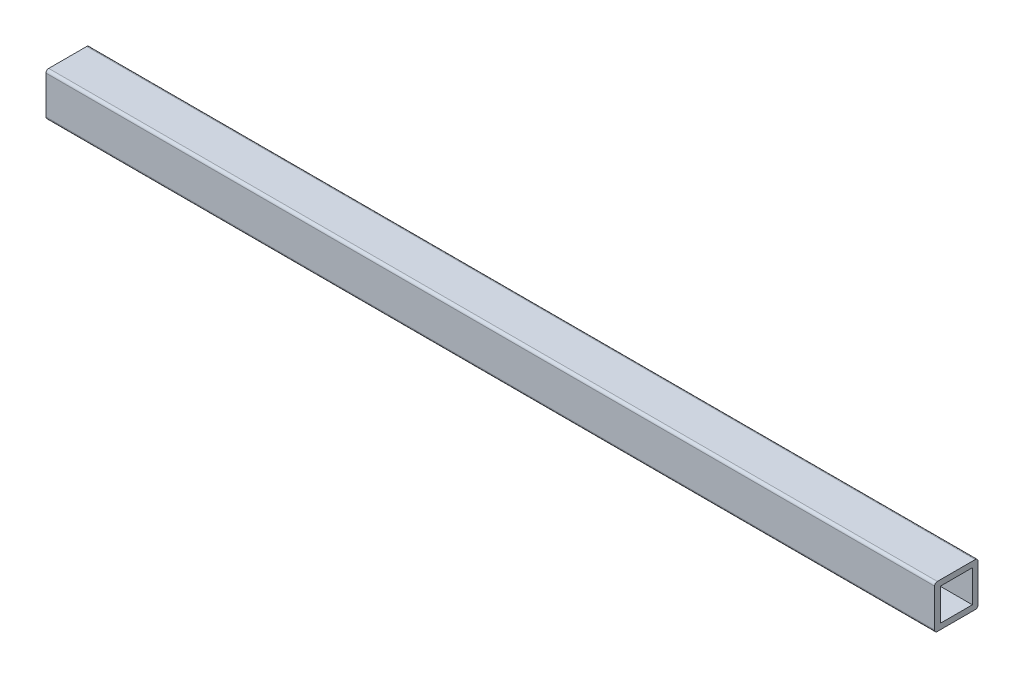
ISO-10303-21;
HEADER;
FILE_DESCRIPTION(('STEP AP214'),'2;1');
FILE_NAME('part.step','',(''),(''),'','','');
FILE_SCHEMA(('AUTOMOTIVE_DESIGN { 1 0 10303 214 1 1 1 1 }'));
ENDSEC;
DATA;
#1=APPLICATION_CONTEXT('core data for automotive mechanical design processes');
#2=APPLICATION_PROTOCOL_DEFINITION('international standard','automotive_design',2000,#1);
#3=PRODUCT_CONTEXT('',#1,'mechanical');
#4=PRODUCT('Part','Part','',(#3));
#5=PRODUCT_RELATED_PRODUCT_CATEGORY('part','',(#4));
#6=PRODUCT_DEFINITION_FORMATION('','',#4);
#7=PRODUCT_DEFINITION_CONTEXT('part definition',#1,'design');
#8=PRODUCT_DEFINITION('design','',#6,#7);
#9=PRODUCT_DEFINITION_SHAPE('','',#8);
#10=(LENGTH_UNIT() NAMED_UNIT(*) SI_UNIT(.MILLI.,.METRE.));
#11=(NAMED_UNIT(*) PLANE_ANGLE_UNIT() SI_UNIT($,.RADIAN.));
#12=(NAMED_UNIT(*) SI_UNIT($,.STERADIAN.) SOLID_ANGLE_UNIT());
#13=UNCERTAINTY_MEASURE_WITH_UNIT(LENGTH_MEASURE(1.E-05),#10,'distance_accuracy_value','');
#14=(GEOMETRIC_REPRESENTATION_CONTEXT(3) GLOBAL_UNCERTAINTY_ASSIGNED_CONTEXT((#13)) GLOBAL_UNIT_ASSIGNED_CONTEXT((#10,
#11,#12)) REPRESENTATION_CONTEXT('',''));
#15=CARTESIAN_POINT('',(0.,0.,0.));
#16=DIRECTION('',(0.,0.,1.));
#17=DIRECTION('',(1.,0.,0.));
#18=AXIS2_PLACEMENT_3D('',#15,#16,#17);
#19=CARTESIAN_POINT('',(260.096,-5.55625,-5.55625));
#20=DIRECTION('',(-1.,0.,0.));
#21=DIRECTION('',(0.,0.,1.));
#22=AXIS2_PLACEMENT_3D('',#19,#20,#21);
#23=CYLINDRICAL_SURFACE('',#22,0.79375);
#24=CARTESIAN_POINT('',(0.,-5.55625,-5.55625));
#25=DIRECTION('',(1.,0.,0.));
#26=DIRECTION('',(0.,0.,-1.));
#27=AXIS2_PLACEMENT_3D('',#24,#25,#26);
#28=CIRCLE('',#27,0.79375);
#29=CARTESIAN_POINT('',(0.,-6.35,-5.55624999999999));
#30=VERTEX_POINT('',#29);
#31=CARTESIAN_POINT('',(0.,-5.55624999999999,-6.35));
#32=VERTEX_POINT('',#31);
#33=EDGE_CURVE('E196',#30,#32,#28,.T.);
#34=ORIENTED_EDGE('',*,*,#33,.T.);
#35=DIRECTION('',(-1.,0.,0.));
#36=VECTOR('',#35,1.);
#37=CARTESIAN_POINT('',(260.096,-5.55624999999999,-6.35));
#38=LINE('',#37,#36);
#39=CARTESIAN_POINT('',(260.096,-5.55624999999999,-6.35));
#40=VERTEX_POINT('',#39);
#41=EDGE_CURVE('E12',#40,#32,#38,.T.);
#42=ORIENTED_EDGE('',*,*,#41,.F.);
#43=CARTESIAN_POINT('',(260.096,-5.55625,-5.55625));
#44=DIRECTION('',(1.,0.,0.));
#45=DIRECTION('',(0.,0.,-1.));
#46=AXIS2_PLACEMENT_3D('',#43,#44,#45);
#47=CIRCLE('',#46,0.79375);
#48=CARTESIAN_POINT('',(260.096,-6.35,-5.55624999999999));
#49=VERTEX_POINT('',#48);
#50=EDGE_CURVE('E249',#49,#40,#47,.T.);
#51=ORIENTED_EDGE('',*,*,#50,.F.);
#52=DIRECTION('',(-1.,0.,0.));
#53=VECTOR('',#52,1.);
#54=CARTESIAN_POINT('',(260.096,-6.35,-5.55624999999999));
#55=LINE('',#54,#53);
#56=EDGE_CURVE('E211',#49,#30,#55,.T.);
#57=ORIENTED_EDGE('',*,*,#56,.T.);
#58=EDGE_LOOP('',(#34,#42,#51,#57));
#59=FACE_BOUND('',#58,.T.);
#60=ADVANCED_FACE('F60',(#59),#23,.T.);
#61=CARTESIAN_POINT('',(260.096,-5.55624999999999,-6.35));
#62=DIRECTION('',(0.,0.,1.));
#63=DIRECTION('',(1.,0.,0.));
#64=AXIS2_PLACEMENT_3D('',#61,#62,#63);
#65=PLANE('',#64);
#66=DIRECTION('',(0.,1.,0.));
#67=VECTOR('',#66,1.);
#68=CARTESIAN_POINT('',(0.,-5.55624999999999,-6.35));
#69=LINE('',#68,#67);
#70=CARTESIAN_POINT('',(0.,5.55625,-6.35));
#71=VERTEX_POINT('',#70);
#72=EDGE_CURVE('E199',#32,#71,#69,.T.);
#73=ORIENTED_EDGE('',*,*,#72,.T.);
#74=DIRECTION('',(-1.,0.,0.));
#75=VECTOR('',#74,1.);
#76=CARTESIAN_POINT('',(260.096,5.55625,-6.35));
#77=LINE('',#76,#75);
#78=CARTESIAN_POINT('',(260.096,5.55625,-6.35));
#79=VERTEX_POINT('',#78);
#80=EDGE_CURVE('E70',#79,#71,#77,.T.);
#81=ORIENTED_EDGE('',*,*,#80,.F.);
#82=DIRECTION('',(0.,1.,0.));
#83=VECTOR('',#82,1.);
#84=CARTESIAN_POINT('',(260.096,-5.55624999999999,-6.35));
#85=LINE('',#84,#83);
#86=EDGE_CURVE('E251',#40,#79,#85,.T.);
#87=ORIENTED_EDGE('',*,*,#86,.F.);
#88=ORIENTED_EDGE('',*,*,#41,.T.);
#89=EDGE_LOOP('',(#73,#81,#87,#88));
#90=FACE_BOUND('',#89,.T.);
#91=ADVANCED_FACE('F286',(#90),#65,.F.);
#92=CARTESIAN_POINT('',(260.096,5.55625,-5.55625));
#93=DIRECTION('',(-1.,0.,0.));
#94=DIRECTION('',(0.,0.,1.));
#95=AXIS2_PLACEMENT_3D('',#92,#93,#94);
#96=CYLINDRICAL_SURFACE('',#95,0.79375);
#97=CARTESIAN_POINT('',(0.,5.55625,-5.55625));
#98=DIRECTION('',(1.,0.,0.));
#99=DIRECTION('',(0.,0.,-1.));
#100=AXIS2_PLACEMENT_3D('',#97,#98,#99);
#101=CIRCLE('',#100,0.79375);
#102=CARTESIAN_POINT('',(0.,6.35,-5.55624999999999));
#103=VERTEX_POINT('',#102);
#104=EDGE_CURVE('E201',#71,#103,#101,.T.);
#105=ORIENTED_EDGE('',*,*,#104,.T.);
#106=DIRECTION('',(-1.,0.,0.));
#107=VECTOR('',#106,1.);
#108=CARTESIAN_POINT('',(260.096,6.35,-5.55624999999999));
#109=LINE('',#108,#107);
#110=CARTESIAN_POINT('',(260.096,6.35,-5.55624999999999));
#111=VERTEX_POINT('',#110);
#112=EDGE_CURVE('E218',#111,#103,#109,.T.);
#113=ORIENTED_EDGE('',*,*,#112,.F.);
#114=CARTESIAN_POINT('',(260.096,5.55625,-5.55625));
#115=DIRECTION('',(1.,0.,0.));
#116=DIRECTION('',(0.,0.,-1.));
#117=AXIS2_PLACEMENT_3D('',#114,#115,#116);
#118=CIRCLE('',#117,0.79375);
#119=EDGE_CURVE('E256',#79,#111,#118,.T.);
#120=ORIENTED_EDGE('',*,*,#119,.F.);
#121=ORIENTED_EDGE('',*,*,#80,.T.);
#122=EDGE_LOOP('',(#105,#113,#120,#121));
#123=FACE_BOUND('',#122,.T.);
#124=ADVANCED_FACE('F291',(#123),#96,.T.);
#125=CARTESIAN_POINT('',(260.096,6.35,5.55625));
#126=DIRECTION('',(0.,-1.,0.));
#127=DIRECTION('',(0.,0.,-1.));
#128=AXIS2_PLACEMENT_3D('',#125,#126,#127);
#129=PLANE('',#128);
#130=DIRECTION('',(0.,0.,1.));
#131=VECTOR('',#130,1.);
#132=CARTESIAN_POINT('',(0.,6.35,5.55625));
#133=LINE('',#132,#131);
#134=CARTESIAN_POINT('',(0.,6.35,5.55625));
#135=VERTEX_POINT('',#134);
#136=EDGE_CURVE('E203',#103,#135,#133,.T.);
#137=ORIENTED_EDGE('',*,*,#136,.T.);
#138=DIRECTION('',(-1.,0.,0.));
#139=VECTOR('',#138,1.);
#140=CARTESIAN_POINT('',(260.096,6.35,5.55625));
#141=LINE('',#140,#139);
#142=CARTESIAN_POINT('',(260.096,6.35,5.55625));
#143=VERTEX_POINT('',#142);
#144=EDGE_CURVE('E215',#143,#135,#141,.T.);
#145=ORIENTED_EDGE('',*,*,#144,.F.);
#146=DIRECTION('',(0.,0.,1.));
#147=VECTOR('',#146,1.);
#148=CARTESIAN_POINT('',(260.096,6.35,5.55625));
#149=LINE('',#148,#147);
#150=EDGE_CURVE('E258',#111,#143,#149,.T.);
#151=ORIENTED_EDGE('',*,*,#150,.F.);
#152=ORIENTED_EDGE('',*,*,#112,.T.);
#153=EDGE_LOOP('',(#137,#145,#151,#152));
#154=FACE_BOUND('',#153,.T.);
#155=ADVANCED_FACE('F264',(#154),#129,.F.);
#156=CARTESIAN_POINT('',(260.096,5.55625,5.55625));
#157=DIRECTION('',(-1.,0.,0.));
#158=DIRECTION('',(0.,0.,1.));
#159=AXIS2_PLACEMENT_3D('',#156,#157,#158);
#160=CYLINDRICAL_SURFACE('',#159,0.79375);
#161=CARTESIAN_POINT('',(0.,5.55625,5.55625));
#162=DIRECTION('',(1.,0.,0.));
#163=DIRECTION('',(0.,0.,1.));
#164=AXIS2_PLACEMENT_3D('',#161,#162,#163);
#165=CIRCLE('',#164,0.79375);
#166=CARTESIAN_POINT('',(0.,5.55624999999999,6.35));
#167=VERTEX_POINT('',#166);
#168=EDGE_CURVE('E205',#135,#167,#165,.T.);
#169=ORIENTED_EDGE('',*,*,#168,.T.);
#170=DIRECTION('',(-1.,0.,0.));
#171=VECTOR('',#170,1.);
#172=CARTESIAN_POINT('',(260.096,5.55624999999999,6.35));
#173=LINE('',#172,#171);
#174=CARTESIAN_POINT('',(260.096,5.55624999999999,6.35));
#175=VERTEX_POINT('',#174);
#176=EDGE_CURVE('E175',#175,#167,#173,.T.);
#177=ORIENTED_EDGE('',*,*,#176,.F.);
#178=CARTESIAN_POINT('',(260.096,5.55625,5.55625));
#179=DIRECTION('',(1.,0.,0.));
#180=DIRECTION('',(0.,0.,1.));
#181=AXIS2_PLACEMENT_3D('',#178,#179,#180);
#182=CIRCLE('',#181,0.79375);
#183=EDGE_CURVE('E166',#143,#175,#182,.T.);
#184=ORIENTED_EDGE('',*,*,#183,.F.);
#185=ORIENTED_EDGE('',*,*,#144,.T.);
#186=EDGE_LOOP('',(#169,#177,#184,#185));
#187=FACE_BOUND('',#186,.T.);
#188=ADVANCED_FACE('F268',(#187),#160,.T.);
#189=CARTESIAN_POINT('',(260.096,-5.55624999999999,6.35));
#190=DIRECTION('',(0.,0.,-1.));
#191=DIRECTION('',(-1.,0.,0.));
#192=AXIS2_PLACEMENT_3D('',#189,#190,#191);
#193=PLANE('',#192);
#194=DIRECTION('',(0.,-1.,0.));
#195=VECTOR('',#194,1.);
#196=CARTESIAN_POINT('',(0.,-5.55624999999999,6.35));
#197=LINE('',#196,#195);
#198=CARTESIAN_POINT('',(0.,-5.55624999999999,6.35));
#199=VERTEX_POINT('',#198);
#200=EDGE_CURVE('E174',#167,#199,#197,.T.);
#201=ORIENTED_EDGE('',*,*,#200,.T.);
#202=DIRECTION('',(-1.,0.,0.));
#203=VECTOR('',#202,1.);
#204=CARTESIAN_POINT('',(260.096,-5.55624999999999,6.35));
#205=LINE('',#204,#203);
#206=CARTESIAN_POINT('',(260.096,-5.55624999999999,6.35));
#207=VERTEX_POINT('',#206);
#208=EDGE_CURVE('E171',#207,#199,#205,.T.);
#209=ORIENTED_EDGE('',*,*,#208,.F.);
#210=DIRECTION('',(0.,-1.,0.));
#211=VECTOR('',#210,1.);
#212=CARTESIAN_POINT('',(260.096,-5.55624999999999,6.35));
#213=LINE('',#212,#211);
#214=EDGE_CURVE('E160',#175,#207,#213,.T.);
#215=ORIENTED_EDGE('',*,*,#214,.F.);
#216=ORIENTED_EDGE('',*,*,#176,.T.);
#217=EDGE_LOOP('',(#201,#209,#215,#216));
#218=FACE_BOUND('',#217,.T.);
#219=ADVANCED_FACE('F172',(#218),#193,.F.);
#220=CARTESIAN_POINT('',(260.096,-5.55625,5.55625));
#221=DIRECTION('',(-1.,0.,0.));
#222=DIRECTION('',(0.,0.,1.));
#223=AXIS2_PLACEMENT_3D('',#220,#221,#222);
#224=CYLINDRICAL_SURFACE('',#223,0.79375);
#225=CARTESIAN_POINT('',(0.,-5.55625,5.55625));
#226=DIRECTION('',(1.,0.,0.));
#227=DIRECTION('',(0.,0.,-1.));
#228=AXIS2_PLACEMENT_3D('',#225,#226,#227);
#229=CIRCLE('',#228,0.79375);
#230=CARTESIAN_POINT('',(0.,-6.35,5.55625));
#231=VERTEX_POINT('',#230);
#232=EDGE_CURVE('E120',#199,#231,#229,.T.);
#233=ORIENTED_EDGE('',*,*,#232,.T.);
#234=DIRECTION('',(-1.,0.,0.));
#235=VECTOR('',#234,1.);
#236=CARTESIAN_POINT('',(260.096,-6.35,5.55625));
#237=LINE('',#236,#235);
#238=CARTESIAN_POINT('',(260.096,-6.35,5.55625));
#239=VERTEX_POINT('',#238);
#240=EDGE_CURVE('E176',#239,#231,#237,.T.);
#241=ORIENTED_EDGE('',*,*,#240,.F.);
#242=CARTESIAN_POINT('',(260.096,-5.55625,5.55625));
#243=DIRECTION('',(1.,0.,0.));
#244=DIRECTION('',(0.,0.,-1.));
#245=AXIS2_PLACEMENT_3D('',#242,#243,#244);
#246=CIRCLE('',#245,0.79375);
#247=EDGE_CURVE('E164',#207,#239,#246,.T.);
#248=ORIENTED_EDGE('',*,*,#247,.F.);
#249=ORIENTED_EDGE('',*,*,#208,.T.);
#250=EDGE_LOOP('',(#233,#241,#248,#249));
#251=FACE_BOUND('',#250,.T.);
#252=ADVANCED_FACE('F178',(#251),#224,.T.);
#253=CARTESIAN_POINT('',(260.096,-4.699,4.699));
#254=DIRECTION('',(0.,0.,-1.));
#255=DIRECTION('',(-1.,0.,0.));
#256=AXIS2_PLACEMENT_3D('',#253,#254,#255);
#257=PLANE('',#256);
#258=DIRECTION('',(0.,-1.,0.));
#259=VECTOR('',#258,1.);
#260=CARTESIAN_POINT('',(0.,-4.699,4.699));
#261=LINE('',#260,#259);
#262=CARTESIAN_POINT('',(0.,4.699,4.699));
#263=VERTEX_POINT('',#262);
#264=CARTESIAN_POINT('',(0.,-4.699,4.699));
#265=VERTEX_POINT('',#264);
#266=EDGE_CURVE('E184',#263,#265,#261,.T.);
#267=ORIENTED_EDGE('',*,*,#266,.F.);
#268=DIRECTION('',(-1.,0.,0.));
#269=VECTOR('',#268,1.);
#270=CARTESIAN_POINT('',(260.096,4.699,4.699));
#271=LINE('',#270,#269);
#272=CARTESIAN_POINT('',(260.096,4.699,4.699));
#273=VERTEX_POINT('',#272);
#274=EDGE_CURVE('E64',#273,#263,#271,.T.);
#275=ORIENTED_EDGE('',*,*,#274,.F.);
#276=DIRECTION('',(0.,-1.,0.));
#277=VECTOR('',#276,1.);
#278=CARTESIAN_POINT('',(260.096,-4.699,4.699));
#279=LINE('',#278,#277);
#280=CARTESIAN_POINT('',(260.096,-4.699,4.699));
#281=VERTEX_POINT('',#280);
#282=EDGE_CURVE('E210',#273,#281,#279,.T.);
#283=ORIENTED_EDGE('',*,*,#282,.T.);
#284=DIRECTION('',(-1.,0.,0.));
#285=VECTOR('',#284,1.);
#286=CARTESIAN_POINT('',(260.096,-4.699,4.699));
#287=LINE('',#286,#285);
#288=EDGE_CURVE('E180',#281,#265,#287,.T.);
#289=ORIENTED_EDGE('',*,*,#288,.T.);
#290=EDGE_LOOP('',(#267,#275,#283,#289));
#291=FACE_BOUND('',#290,.T.);
#292=ADVANCED_FACE('F62',(#291),#257,.T.);
#293=CARTESIAN_POINT('',(260.096,4.699,4.699));
#294=DIRECTION('',(0.,-1.,0.));
#295=DIRECTION('',(0.,0.,-1.));
#296=AXIS2_PLACEMENT_3D('',#293,#294,#295);
#297=PLANE('',#296);
#298=DIRECTION('',(0.,0.,1.));
#299=VECTOR('',#298,1.);
#300=CARTESIAN_POINT('',(0.,4.699,4.699));
#301=LINE('',#300,#299);
#302=CARTESIAN_POINT('',(0.,4.699,-4.699));
#303=VERTEX_POINT('',#302);
#304=EDGE_CURVE('E187',#303,#263,#301,.T.);
#305=ORIENTED_EDGE('',*,*,#304,.F.);
#306=DIRECTION('',(-1.,0.,0.));
#307=VECTOR('',#306,1.);
#308=CARTESIAN_POINT('',(260.096,4.699,-4.699));
#309=LINE('',#308,#307);
#310=CARTESIAN_POINT('',(260.096,4.699,-4.699));
#311=VERTEX_POINT('',#310);
#312=EDGE_CURVE('E225',#311,#303,#309,.T.);
#313=ORIENTED_EDGE('',*,*,#312,.F.);
#314=DIRECTION('',(0.,0.,1.));
#315=VECTOR('',#314,1.);
#316=CARTESIAN_POINT('',(260.096,4.699,4.699));
#317=LINE('',#316,#315);
#318=EDGE_CURVE('E234',#311,#273,#317,.T.);
#319=ORIENTED_EDGE('',*,*,#318,.T.);
#320=ORIENTED_EDGE('',*,*,#274,.T.);
#321=EDGE_LOOP('',(#305,#313,#319,#320));
#322=FACE_BOUND('',#321,.T.);
#323=ADVANCED_FACE('F232',(#322),#297,.T.);
#324=CARTESIAN_POINT('',(260.096,-4.699,-4.699));
#325=DIRECTION('',(0.,0.,1.));
#326=DIRECTION('',(0.,-1.,0.));
#327=AXIS2_PLACEMENT_3D('',#324,#325,#326);
#328=PLANE('',#327);
#329=DIRECTION('',(0.,1.,0.));
#330=VECTOR('',#329,1.);
#331=CARTESIAN_POINT('',(0.,-4.699,-4.699));
#332=LINE('',#331,#330);
#333=CARTESIAN_POINT('',(0.,-4.699,-4.699));
#334=VERTEX_POINT('',#333);
#335=EDGE_CURVE('E190',#334,#303,#332,.T.);
#336=ORIENTED_EDGE('',*,*,#335,.F.);
#337=DIRECTION('',(-1.,0.,0.));
#338=VECTOR('',#337,1.);
#339=CARTESIAN_POINT('',(260.096,-4.699,-4.699));
#340=LINE('',#339,#338);
#341=CARTESIAN_POINT('',(260.096,-4.699,-4.699));
#342=VERTEX_POINT('',#341);
#343=EDGE_CURVE('E224',#342,#334,#340,.T.);
#344=ORIENTED_EDGE('',*,*,#343,.F.);
#345=DIRECTION('',(0.,1.,0.));
#346=VECTOR('',#345,1.);
#347=CARTESIAN_POINT('',(260.096,-4.699,-4.699));
#348=LINE('',#347,#346);
#349=EDGE_CURVE('E241',#342,#311,#348,.T.);
#350=ORIENTED_EDGE('',*,*,#349,.T.);
#351=ORIENTED_EDGE('',*,*,#312,.T.);
#352=EDGE_LOOP('',(#336,#344,#350,#351));
#353=FACE_BOUND('',#352,.T.);
#354=ADVANCED_FACE('F239',(#353),#328,.T.);
#355=CARTESIAN_POINT('',(260.096,-4.699,4.699));
#356=DIRECTION('',(0.,1.,0.));
#357=DIRECTION('',(0.,0.,1.));
#358=AXIS2_PLACEMENT_3D('',#355,#356,#357);
#359=PLANE('',#358);
#360=DIRECTION('',(0.,0.,-1.));
#361=VECTOR('',#360,1.);
#362=CARTESIAN_POINT('',(0.,-4.699,4.699));
#363=LINE('',#362,#361);
#364=EDGE_CURVE('E193',#265,#334,#363,.T.);
#365=ORIENTED_EDGE('',*,*,#364,.F.);
#366=ORIENTED_EDGE('',*,*,#288,.F.);
#367=DIRECTION('',(0.,0.,-1.));
#368=VECTOR('',#367,1.);
#369=CARTESIAN_POINT('',(260.096,-4.699,4.699));
#370=LINE('',#369,#368);
#371=EDGE_CURVE('E246',#281,#342,#370,.T.);
#372=ORIENTED_EDGE('',*,*,#371,.T.);
#373=ORIENTED_EDGE('',*,*,#343,.T.);
#374=EDGE_LOOP('',(#365,#366,#372,#373));
#375=FACE_BOUND('',#374,.T.);
#376=ADVANCED_FACE('F248',(#375),#359,.T.);
#377=CARTESIAN_POINT('',(260.096,-6.35,5.55625));
#378=DIRECTION('',(0.,1.,0.));
#379=DIRECTION('',(0.,0.,1.));
#380=AXIS2_PLACEMENT_3D('',#377,#378,#379);
#381=PLANE('',#380);
#382=DIRECTION('',(0.,0.,-1.));
#383=VECTOR('',#382,1.);
#384=CARTESIAN_POINT('',(0.,-6.35,5.55625));
#385=LINE('',#384,#383);
#386=EDGE_CURVE('E126',#231,#30,#385,.T.);
#387=ORIENTED_EDGE('',*,*,#386,.T.);
#388=ORIENTED_EDGE('',*,*,#56,.F.);
#389=DIRECTION('',(0.,0.,-1.));
#390=VECTOR('',#389,1.);
#391=CARTESIAN_POINT('',(260.096,-6.35,5.55625));
#392=LINE('',#391,#390);
#393=EDGE_CURVE('E79',#239,#49,#392,.T.);
#394=ORIENTED_EDGE('',*,*,#393,.F.);
#395=ORIENTED_EDGE('',*,*,#240,.T.);
#396=EDGE_LOOP('',(#387,#388,#394,#395));
#397=FACE_BOUND('',#396,.T.);
#398=ADVANCED_FACE('F274',(#397),#381,.F.);
#399=CARTESIAN_POINT('',(260.096,-5.55625,-5.55625));
#400=DIRECTION('',(1.,0.,0.));
#401=DIRECTION('',(0.,0.,-1.));
#402=AXIS2_PLACEMENT_3D('',#399,#400,#401);
#403=PLANE('',#402);
#404=ORIENTED_EDGE('',*,*,#282,.F.);
#405=ORIENTED_EDGE('',*,*,#318,.F.);
#406=ORIENTED_EDGE('',*,*,#349,.F.);
#407=ORIENTED_EDGE('',*,*,#371,.F.);
#408=EDGE_LOOP('',(#404,#405,#406,#407));
#409=FACE_BOUND('',#408,.T.);
#410=ORIENTED_EDGE('',*,*,#50,.T.);
#411=ORIENTED_EDGE('',*,*,#86,.T.);
#412=ORIENTED_EDGE('',*,*,#119,.T.);
#413=ORIENTED_EDGE('',*,*,#150,.T.);
#414=ORIENTED_EDGE('',*,*,#183,.T.);
#415=ORIENTED_EDGE('',*,*,#214,.T.);
#416=ORIENTED_EDGE('',*,*,#247,.T.);
#417=ORIENTED_EDGE('',*,*,#393,.T.);
#418=EDGE_LOOP('',(#410,#411,#412,#413,#414,#415,#416,#417));
#419=FACE_BOUND('',#418,.T.);
#420=ADVANCED_FACE('F162',(#409,#419),#403,.T.);
#421=CARTESIAN_POINT('',(0.,-5.55625,-5.55625));
#422=DIRECTION('',(1.,0.,0.));
#423=DIRECTION('',(0.,0.,-1.));
#424=AXIS2_PLACEMENT_3D('',#421,#422,#423);
#425=PLANE('',#424);
#426=ORIENTED_EDGE('',*,*,#266,.T.);
#427=ORIENTED_EDGE('',*,*,#364,.T.);
#428=ORIENTED_EDGE('',*,*,#335,.T.);
#429=ORIENTED_EDGE('',*,*,#304,.T.);
#430=EDGE_LOOP('',(#426,#427,#428,#429));
#431=FACE_BOUND('',#430,.T.);
#432=ORIENTED_EDGE('',*,*,#33,.F.);
#433=ORIENTED_EDGE('',*,*,#386,.F.);
#434=ORIENTED_EDGE('',*,*,#232,.F.);
#435=ORIENTED_EDGE('',*,*,#200,.F.);
#436=ORIENTED_EDGE('',*,*,#168,.F.);
#437=ORIENTED_EDGE('',*,*,#136,.F.);
#438=ORIENTED_EDGE('',*,*,#104,.F.);
#439=ORIENTED_EDGE('',*,*,#72,.F.);
#440=EDGE_LOOP('',(#432,#433,#434,#435,#436,#437,#438,#439));
#441=FACE_BOUND('',#440,.T.);
#442=ADVANCED_FACE('F237',(#431,#441),#425,.F.);
#443=CLOSED_SHELL('',(#60,#91,#124,#155,#188,#219,#252,#292,#323,#354,#376,#398,#420,#442));
#444=MANIFOLD_SOLID_BREP('B2',#443);
#445=ADVANCED_BREP_SHAPE_REPRESENTATION('',(#18,#444),#14);
#446=SHAPE_DEFINITION_REPRESENTATION(#9,#445);
ENDSEC;
END-ISO-10303-21;
